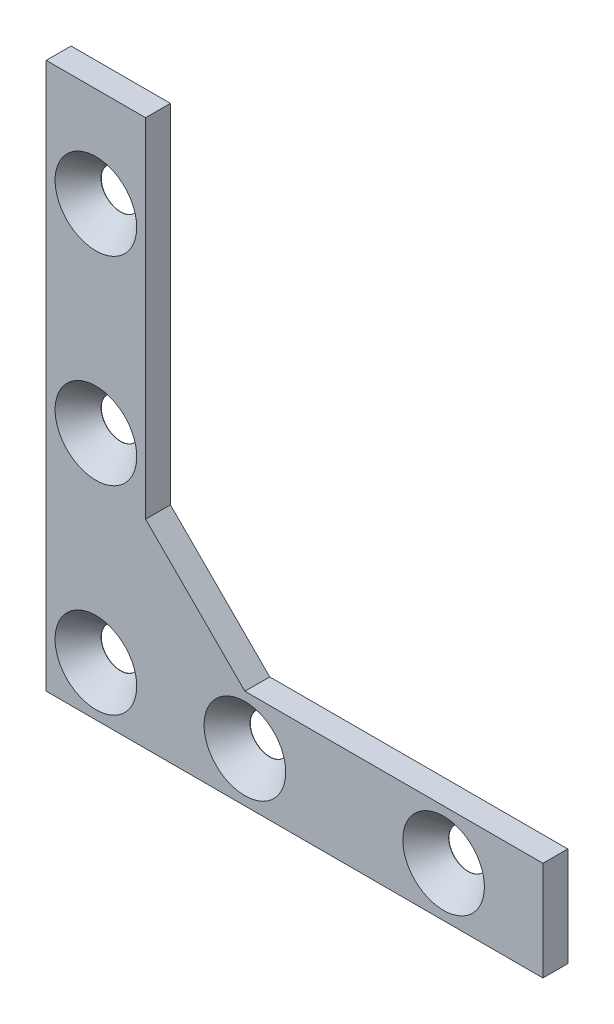
ISO-10303-21;
HEADER;
FILE_DESCRIPTION(('STEP AP214'),'2;1');
FILE_NAME('part.step','',(''),(''),'','','');
FILE_SCHEMA(('AUTOMOTIVE_DESIGN { 1 0 10303 214 1 1 1 1 }'));
ENDSEC;
DATA;
#1=APPLICATION_CONTEXT('core data for automotive mechanical design processes');
#2=APPLICATION_PROTOCOL_DEFINITION('international standard','automotive_design',2000,#1);
#3=PRODUCT_CONTEXT('',#1,'mechanical');
#4=PRODUCT('Part','Part','',(#3));
#5=PRODUCT_RELATED_PRODUCT_CATEGORY('part','',(#4));
#6=PRODUCT_DEFINITION_FORMATION('','',#4);
#7=PRODUCT_DEFINITION_CONTEXT('part definition',#1,'design');
#8=PRODUCT_DEFINITION('design','',#6,#7);
#9=PRODUCT_DEFINITION_SHAPE('','',#8);
#10=(LENGTH_UNIT() NAMED_UNIT(*) SI_UNIT(.MILLI.,.METRE.));
#11=(NAMED_UNIT(*) PLANE_ANGLE_UNIT() SI_UNIT($,.RADIAN.));
#12=(NAMED_UNIT(*) SI_UNIT($,.STERADIAN.) SOLID_ANGLE_UNIT());
#13=UNCERTAINTY_MEASURE_WITH_UNIT(LENGTH_MEASURE(1.E-05),#10,'distance_accuracy_value','');
#14=(GEOMETRIC_REPRESENTATION_CONTEXT(3) GLOBAL_UNCERTAINTY_ASSIGNED_CONTEXT((#13)) GLOBAL_UNIT_ASSIGNED_CONTEXT((#10,
#11,#12)) REPRESENTATION_CONTEXT('',''));
#15=CARTESIAN_POINT('',(0.,0.,0.));
#16=DIRECTION('',(0.,0.,1.));
#17=DIRECTION('',(1.,0.,0.));
#18=AXIS2_PLACEMENT_3D('',#15,#16,#17);
#19=CARTESIAN_POINT('',(-273.453367516007,-6.34999999999997,3.175));
#20=DIRECTION('',(0.,1.,0.));
#21=DIRECTION('',(0.,0.,1.));
#22=AXIS2_PLACEMENT_3D('',#19,#20,#21);
#23=PLANE('',#22);
#24=DIRECTION('',(1.,0.,0.));
#25=VECTOR('',#24,1.);
#26=CARTESIAN_POINT('',(-273.453367516007,-6.34999999999997,0.));
#27=LINE('',#26,#25);
#28=CARTESIAN_POINT('',(-273.453367516007,-6.34999999999997,0.));
#29=VERTEX_POINT('',#28);
#30=CARTESIAN_POINT('',(-209.953367516007,-6.34999999999997,0.));
#31=VERTEX_POINT('',#30);
#32=EDGE_CURVE('E129',#29,#31,#27,.T.);
#33=ORIENTED_EDGE('',*,*,#32,.T.);
#34=DIRECTION('',(0.,0.,-1.));
#35=VECTOR('',#34,1.);
#36=CARTESIAN_POINT('',(-209.953367516007,-6.34999999999997,3.175));
#37=LINE('',#36,#35);
#38=CARTESIAN_POINT('',(-209.953367516007,-6.34999999999997,3.175));
#39=VERTEX_POINT('',#38);
#40=EDGE_CURVE('E11',#39,#31,#37,.T.);
#41=ORIENTED_EDGE('',*,*,#40,.F.);
#42=DIRECTION('',(1.,0.,0.));
#43=VECTOR('',#42,1.);
#44=CARTESIAN_POINT('',(-273.453367516007,-6.34999999999997,3.175));
#45=LINE('',#44,#43);
#46=CARTESIAN_POINT('',(-273.453367516007,-6.34999999999997,3.175));
#47=VERTEX_POINT('',#46);
#48=EDGE_CURVE('E142',#47,#39,#45,.T.);
#49=ORIENTED_EDGE('',*,*,#48,.F.);
#50=DIRECTION('',(0.,0.,-1.));
#51=VECTOR('',#50,1.);
#52=CARTESIAN_POINT('',(-273.453367516007,-6.34999999999997,3.175));
#53=LINE('',#52,#51);
#54=EDGE_CURVE('E125',#47,#29,#53,.T.);
#55=ORIENTED_EDGE('',*,*,#54,.T.);
#56=EDGE_LOOP('',(#33,#41,#49,#55));
#57=FACE_BOUND('',#56,.T.);
#58=ADVANCED_FACE('F39',(#57),#23,.F.);
#59=CARTESIAN_POINT('',(-209.953367516007,-6.34999999999997,3.175));
#60=DIRECTION('',(-1.,0.,0.));
#61=DIRECTION('',(0.,0.,1.));
#62=AXIS2_PLACEMENT_3D('',#59,#60,#61);
#63=PLANE('',#62);
#64=DIRECTION('',(0.,1.,0.));
#65=VECTOR('',#64,1.);
#66=CARTESIAN_POINT('',(-209.953367516007,-6.34999999999997,0.));
#67=LINE('',#66,#65);
#68=CARTESIAN_POINT('',(-209.953367516007,6.3500000000002,0.));
#69=VERTEX_POINT('',#68);
#70=EDGE_CURVE('E132',#31,#69,#67,.T.);
#71=ORIENTED_EDGE('',*,*,#70,.T.);
#72=DIRECTION('',(0.,0.,-1.));
#73=VECTOR('',#72,1.);
#74=CARTESIAN_POINT('',(-209.953367516007,6.3500000000002,3.175));
#75=LINE('',#74,#73);
#76=CARTESIAN_POINT('',(-209.953367516007,6.3500000000002,3.175));
#77=VERTEX_POINT('',#76);
#78=EDGE_CURVE('E47',#77,#69,#75,.T.);
#79=ORIENTED_EDGE('',*,*,#78,.F.);
#80=DIRECTION('',(0.,1.,0.));
#81=VECTOR('',#80,1.);
#82=CARTESIAN_POINT('',(-209.953367516007,-6.34999999999997,3.175));
#83=LINE('',#82,#81);
#84=EDGE_CURVE('E95',#39,#77,#83,.T.);
#85=ORIENTED_EDGE('',*,*,#84,.F.);
#86=ORIENTED_EDGE('',*,*,#40,.T.);
#87=EDGE_LOOP('',(#71,#79,#85,#86));
#88=FACE_BOUND('',#87,.T.);
#89=ADVANCED_FACE('F241',(#88),#63,.F.);
#90=CARTESIAN_POINT('',(-209.953367516007,6.3500000000002,3.175));
#91=DIRECTION('',(0.,-1.,0.));
#92=DIRECTION('',(1.,0.,0.));
#93=AXIS2_PLACEMENT_3D('',#90,#91,#92);
#94=PLANE('',#93);
#95=DIRECTION('',(-1.,0.,0.));
#96=VECTOR('',#95,1.);
#97=CARTESIAN_POINT('',(-209.953367516007,6.3500000000002,0.));
#98=LINE('',#97,#96);
#99=CARTESIAN_POINT('',(-248.053367516008,6.35000000000003,0.));
#100=VERTEX_POINT('',#99);
#101=EDGE_CURVE('E135',#69,#100,#98,.T.);
#102=ORIENTED_EDGE('',*,*,#101,.T.);
#103=DIRECTION('',(0.,0.,-1.));
#104=VECTOR('',#103,1.);
#105=CARTESIAN_POINT('',(-248.053367516008,6.35000000000003,3.175));
#106=LINE('',#105,#104);
#107=CARTESIAN_POINT('',(-248.053367516008,6.35000000000003,3.175));
#108=VERTEX_POINT('',#107);
#109=EDGE_CURVE('E146',#108,#100,#106,.T.);
#110=ORIENTED_EDGE('',*,*,#109,.F.);
#111=DIRECTION('',(-1.,0.,0.));
#112=VECTOR('',#111,1.);
#113=CARTESIAN_POINT('',(-209.953367516007,6.3500000000002,3.175));
#114=LINE('',#113,#112);
#115=EDGE_CURVE('E154',#77,#108,#114,.T.);
#116=ORIENTED_EDGE('',*,*,#115,.F.);
#117=ORIENTED_EDGE('',*,*,#78,.T.);
#118=EDGE_LOOP('',(#102,#110,#116,#117));
#119=FACE_BOUND('',#118,.T.);
#120=ADVANCED_FACE('F152',(#119),#94,.F.);
#121=CARTESIAN_POINT('',(-248.053367516008,6.35000000000003,3.175));
#122=DIRECTION('',(-0.707106781186556,-0.707106781186539,0.));
#123=DIRECTION('',(0.707106781186539,-0.707106781186556,0.));
#124=AXIS2_PLACEMENT_3D('',#121,#122,#123);
#125=PLANE('',#124);
#126=DIRECTION('',(-0.707106781186539,0.707106781186556,0.));
#127=VECTOR('',#126,1.);
#128=CARTESIAN_POINT('',(-248.053367516008,6.35000000000003,0.));
#129=LINE('',#128,#127);
#130=CARTESIAN_POINT('',(-260.753367516007,19.05,0.));
#131=VERTEX_POINT('',#130);
#132=EDGE_CURVE('E137',#100,#131,#129,.T.);
#133=ORIENTED_EDGE('',*,*,#132,.T.);
#134=DIRECTION('',(0.,0.,-1.));
#135=VECTOR('',#134,1.);
#136=CARTESIAN_POINT('',(-260.753367516007,19.05,3.175));
#137=LINE('',#136,#135);
#138=CARTESIAN_POINT('',(-260.753367516007,19.05,3.175));
#139=VERTEX_POINT('',#138);
#140=EDGE_CURVE('E120',#139,#131,#137,.T.);
#141=ORIENTED_EDGE('',*,*,#140,.F.);
#142=DIRECTION('',(-0.707106781186539,0.707106781186556,0.));
#143=VECTOR('',#142,1.);
#144=CARTESIAN_POINT('',(-248.053367516008,6.35000000000003,3.175));
#145=LINE('',#144,#143);
#146=EDGE_CURVE('E111',#108,#139,#145,.T.);
#147=ORIENTED_EDGE('',*,*,#146,.F.);
#148=ORIENTED_EDGE('',*,*,#109,.T.);
#149=EDGE_LOOP('',(#133,#141,#147,#148));
#150=FACE_BOUND('',#149,.T.);
#151=ADVANCED_FACE('F160',(#150),#125,.F.);
#152=CARTESIAN_POINT('',(-260.753367516007,19.05,3.175));
#153=DIRECTION('',(-1.,0.,0.));
#154=DIRECTION('',(0.,0.,1.));
#155=AXIS2_PLACEMENT_3D('',#152,#153,#154);
#156=PLANE('',#155);
#157=DIRECTION('',(0.,1.,0.));
#158=VECTOR('',#157,1.);
#159=CARTESIAN_POINT('',(-260.753367516007,19.05,0.));
#160=LINE('',#159,#158);
#161=CARTESIAN_POINT('',(-260.753367516007,63.5,0.));
#162=VERTEX_POINT('',#161);
#163=EDGE_CURVE('E119',#131,#162,#160,.T.);
#164=ORIENTED_EDGE('',*,*,#163,.T.);
#165=DIRECTION('',(0.,0.,-1.));
#166=VECTOR('',#165,1.);
#167=CARTESIAN_POINT('',(-260.753367516007,63.5,3.175));
#168=LINE('',#167,#166);
#169=CARTESIAN_POINT('',(-260.753367516007,63.5,3.175));
#170=VERTEX_POINT('',#169);
#171=EDGE_CURVE('E116',#170,#162,#168,.T.);
#172=ORIENTED_EDGE('',*,*,#171,.F.);
#173=DIRECTION('',(0.,1.,0.));
#174=VECTOR('',#173,1.);
#175=CARTESIAN_POINT('',(-260.753367516007,19.05,3.175));
#176=LINE('',#175,#174);
#177=EDGE_CURVE('E105',#139,#170,#176,.T.);
#178=ORIENTED_EDGE('',*,*,#177,.F.);
#179=ORIENTED_EDGE('',*,*,#140,.T.);
#180=EDGE_LOOP('',(#164,#172,#178,#179));
#181=FACE_BOUND('',#180,.T.);
#182=ADVANCED_FACE('F117',(#181),#156,.F.);
#183=CARTESIAN_POINT('',(-273.453367516007,63.5,3.175));
#184=DIRECTION('',(0.,-1.,0.));
#185=DIRECTION('',(0.,0.,-1.));
#186=AXIS2_PLACEMENT_3D('',#183,#184,#185);
#187=PLANE('',#186);
#188=DIRECTION('',(-1.,0.,0.));
#189=VECTOR('',#188,1.);
#190=CARTESIAN_POINT('',(-273.453367516007,63.5,0.));
#191=LINE('',#190,#189);
#192=CARTESIAN_POINT('',(-273.453367516007,63.5,0.));
#193=VERTEX_POINT('',#192);
#194=EDGE_CURVE('E81',#162,#193,#191,.T.);
#195=ORIENTED_EDGE('',*,*,#194,.T.);
#196=DIRECTION('',(0.,0.,-1.));
#197=VECTOR('',#196,1.);
#198=CARTESIAN_POINT('',(-273.453367516007,63.5,3.175));
#199=LINE('',#198,#197);
#200=CARTESIAN_POINT('',(-273.453367516007,63.5,3.175));
#201=VERTEX_POINT('',#200);
#202=EDGE_CURVE('E121',#201,#193,#199,.T.);
#203=ORIENTED_EDGE('',*,*,#202,.F.);
#204=DIRECTION('',(-1.,0.,0.));
#205=VECTOR('',#204,1.);
#206=CARTESIAN_POINT('',(-273.453367516007,63.5,3.175));
#207=LINE('',#206,#205);
#208=EDGE_CURVE('E109',#170,#201,#207,.T.);
#209=ORIENTED_EDGE('',*,*,#208,.F.);
#210=ORIENTED_EDGE('',*,*,#171,.T.);
#211=EDGE_LOOP('',(#195,#203,#209,#210));
#212=FACE_BOUND('',#211,.T.);
#213=ADVANCED_FACE('F123',(#212),#187,.F.);
#214=CARTESIAN_POINT('',(-273.453367516007,-6.34999999999997,3.175));
#215=DIRECTION('',(1.,0.,0.));
#216=DIRECTION('',(0.,0.,-1.));
#217=AXIS2_PLACEMENT_3D('',#214,#215,#216);
#218=PLANE('',#217);
#219=DIRECTION('',(0.,-1.,0.));
#220=VECTOR('',#219,1.);
#221=CARTESIAN_POINT('',(-273.453367516007,-6.34999999999997,0.));
#222=LINE('',#221,#220);
#223=EDGE_CURVE('E87',#193,#29,#222,.T.);
#224=ORIENTED_EDGE('',*,*,#223,.T.);
#225=ORIENTED_EDGE('',*,*,#54,.F.);
#226=DIRECTION('',(0.,-1.,0.));
#227=VECTOR('',#226,1.);
#228=CARTESIAN_POINT('',(-273.453367516007,-6.34999999999997,3.175));
#229=LINE('',#228,#227);
#230=EDGE_CURVE('E55',#201,#47,#229,.T.);
#231=ORIENTED_EDGE('',*,*,#230,.F.);
#232=ORIENTED_EDGE('',*,*,#202,.T.);
#233=EDGE_LOOP('',(#224,#225,#231,#232));
#234=FACE_BOUND('',#233,.T.);
#235=ADVANCED_FACE('F214',(#234),#218,.F.);
#236=CARTESIAN_POINT('',(0.,0.,3.175));
#237=DIRECTION('',(0.,0.,1.));
#238=DIRECTION('',(1.,0.,0.));
#239=AXIS2_PLACEMENT_3D('',#236,#237,#238);
#240=PLANE('',#239);
#241=CARTESIAN_POINT('',(-267.103367516007,0.,3.175));
#242=DIRECTION('',(0.,0.,1.));
#243=DIRECTION('',(1.,0.,0.));
#244=AXIS2_PLACEMENT_3D('',#241,#242,#243);
#245=CIRCLE('',#244,5.21969999999999);
#246=CARTESIAN_POINT('',(-261.883667516008,0.,3.175));
#247=VERTEX_POINT('',#246);
#248=EDGE_CURVE('E206',#247,#247,#245,.T.);
#249=ORIENTED_EDGE('',*,*,#248,.F.);
#250=EDGE_LOOP('',(#249));
#251=FACE_BOUND('',#250,.T.);
#252=CARTESIAN_POINT('',(-267.103367516007,25.4,3.175));
#253=DIRECTION('',(0.,0.,1.));
#254=DIRECTION('',(1.,0.,0.));
#255=AXIS2_PLACEMENT_3D('',#252,#253,#254);
#256=CIRCLE('',#255,5.21969999999999);
#257=CARTESIAN_POINT('',(-261.883667516008,25.4,3.175));
#258=VERTEX_POINT('',#257);
#259=EDGE_CURVE('E197',#258,#258,#256,.T.);
#260=ORIENTED_EDGE('',*,*,#259,.F.);
#261=EDGE_LOOP('',(#260));
#262=FACE_BOUND('',#261,.T.);
#263=CARTESIAN_POINT('',(-267.103367516007,50.8,3.175));
#264=DIRECTION('',(0.,0.,1.));
#265=DIRECTION('',(1.,0.,0.));
#266=AXIS2_PLACEMENT_3D('',#263,#264,#265);
#267=CIRCLE('',#266,5.21969999999999);
#268=CARTESIAN_POINT('',(-261.883667516008,50.8,3.175));
#269=VERTEX_POINT('',#268);
#270=EDGE_CURVE('E188',#269,#269,#267,.T.);
#271=ORIENTED_EDGE('',*,*,#270,.F.);
#272=EDGE_LOOP('',(#271));
#273=FACE_BOUND('',#272,.T.);
#274=CARTESIAN_POINT('',(-248.053367516007,0.,3.175));
#275=DIRECTION('',(0.,0.,1.));
#276=DIRECTION('',(1.,0.,0.));
#277=AXIS2_PLACEMENT_3D('',#274,#275,#276);
#278=CIRCLE('',#277,5.21969999999999);
#279=CARTESIAN_POINT('',(-242.833667516007,0.,3.175));
#280=VERTEX_POINT('',#279);
#281=EDGE_CURVE('E179',#280,#280,#278,.T.);
#282=ORIENTED_EDGE('',*,*,#281,.F.);
#283=EDGE_LOOP('',(#282));
#284=FACE_BOUND('',#283,.T.);
#285=CARTESIAN_POINT('',(-222.653367516007,0.,3.175));
#286=DIRECTION('',(0.,0.,1.));
#287=DIRECTION('',(1.,0.,0.));
#288=AXIS2_PLACEMENT_3D('',#285,#286,#287);
#289=CIRCLE('',#288,5.21969999999999);
#290=CARTESIAN_POINT('',(-217.433667516007,0.,3.175));
#291=VERTEX_POINT('',#290);
#292=EDGE_CURVE('E170',#291,#291,#289,.T.);
#293=ORIENTED_EDGE('',*,*,#292,.F.);
#294=EDGE_LOOP('',(#293));
#295=FACE_BOUND('',#294,.T.);
#296=ORIENTED_EDGE('',*,*,#48,.T.);
#297=ORIENTED_EDGE('',*,*,#84,.T.);
#298=ORIENTED_EDGE('',*,*,#115,.T.);
#299=ORIENTED_EDGE('',*,*,#146,.T.);
#300=ORIENTED_EDGE('',*,*,#177,.T.);
#301=ORIENTED_EDGE('',*,*,#208,.T.);
#302=ORIENTED_EDGE('',*,*,#230,.T.);
#303=EDGE_LOOP('',(#296,#297,#298,#299,#300,#301,#302));
#304=FACE_BOUND('',#303,.T.);
#305=ADVANCED_FACE('F107',(#251,#262,#273,#284,#295,#304),#240,.T.);
#306=CARTESIAN_POINT('',(0.,0.,0.));
#307=DIRECTION('',(0.,0.,1.));
#308=DIRECTION('',(1.,0.,0.));
#309=AXIS2_PLACEMENT_3D('',#306,#307,#308);
#310=PLANE('',#309);
#311=CARTESIAN_POINT('',(-267.103367516007,0.,0.));
#312=DIRECTION('',(0.,0.,1.));
#313=DIRECTION('',(1.,0.,0.));
#314=AXIS2_PLACEMENT_3D('',#311,#312,#313);
#315=CIRCLE('',#314,2.48920000000002);
#316=CARTESIAN_POINT('',(-264.614167516007,0.,0.));
#317=VERTEX_POINT('',#316);
#318=EDGE_CURVE('E200',#317,#317,#315,.T.);
#319=ORIENTED_EDGE('',*,*,#318,.T.);
#320=EDGE_LOOP('',(#319));
#321=FACE_BOUND('',#320,.T.);
#322=CARTESIAN_POINT('',(-267.103367516007,25.4,0.));
#323=DIRECTION('',(0.,0.,1.));
#324=DIRECTION('',(1.,0.,0.));
#325=AXIS2_PLACEMENT_3D('',#322,#323,#324);
#326=CIRCLE('',#325,2.48920000000002);
#327=CARTESIAN_POINT('',(-264.614167516007,25.4,0.));
#328=VERTEX_POINT('',#327);
#329=EDGE_CURVE('E191',#328,#328,#326,.T.);
#330=ORIENTED_EDGE('',*,*,#329,.T.);
#331=EDGE_LOOP('',(#330));
#332=FACE_BOUND('',#331,.T.);
#333=CARTESIAN_POINT('',(-267.103367516007,50.8,0.));
#334=DIRECTION('',(0.,0.,1.));
#335=DIRECTION('',(1.,0.,0.));
#336=AXIS2_PLACEMENT_3D('',#333,#334,#335);
#337=CIRCLE('',#336,2.48920000000002);
#338=CARTESIAN_POINT('',(-264.614167516007,50.8,0.));
#339=VERTEX_POINT('',#338);
#340=EDGE_CURVE('E182',#339,#339,#337,.T.);
#341=ORIENTED_EDGE('',*,*,#340,.T.);
#342=EDGE_LOOP('',(#341));
#343=FACE_BOUND('',#342,.T.);
#344=CARTESIAN_POINT('',(-248.053367516007,0.,0.));
#345=DIRECTION('',(0.,0.,1.));
#346=DIRECTION('',(1.,0.,0.));
#347=AXIS2_PLACEMENT_3D('',#344,#345,#346);
#348=CIRCLE('',#347,2.4892);
#349=CARTESIAN_POINT('',(-245.564167516007,0.,0.));
#350=VERTEX_POINT('',#349);
#351=EDGE_CURVE('E173',#350,#350,#348,.T.);
#352=ORIENTED_EDGE('',*,*,#351,.T.);
#353=EDGE_LOOP('',(#352));
#354=FACE_BOUND('',#353,.T.);
#355=CARTESIAN_POINT('',(-222.653367516007,0.,0.));
#356=DIRECTION('',(0.,0.,1.));
#357=DIRECTION('',(1.,0.,0.));
#358=AXIS2_PLACEMENT_3D('',#355,#356,#357);
#359=CIRCLE('',#358,2.4892);
#360=CARTESIAN_POINT('',(-220.164167516007,0.,0.));
#361=VERTEX_POINT('',#360);
#362=EDGE_CURVE('E133',#361,#361,#359,.T.);
#363=ORIENTED_EDGE('',*,*,#362,.T.);
#364=EDGE_LOOP('',(#363));
#365=FACE_BOUND('',#364,.T.);
#366=ORIENTED_EDGE('',*,*,#32,.F.);
#367=ORIENTED_EDGE('',*,*,#223,.F.);
#368=ORIENTED_EDGE('',*,*,#194,.F.);
#369=ORIENTED_EDGE('',*,*,#163,.F.);
#370=ORIENTED_EDGE('',*,*,#132,.F.);
#371=ORIENTED_EDGE('',*,*,#101,.F.);
#372=ORIENTED_EDGE('',*,*,#70,.F.);
#373=EDGE_LOOP('',(#366,#367,#368,#369,#370,#371,#372));
#374=FACE_BOUND('',#373,.T.);
#375=ADVANCED_FACE('F158',(#321,#332,#343,#354,#365,#374),#310,.F.);
#376=CARTESIAN_POINT('',(-222.653367516007,0.,3.175));
#377=DIRECTION('',(0.,0.,1.));
#378=DIRECTION('',(1.,0.,0.));
#379=AXIS2_PLACEMENT_3D('',#376,#377,#378);
#380=CYLINDRICAL_SURFACE('',#379,2.4892);
#381=ORIENTED_EDGE('',*,*,#362,.F.);
#382=EDGE_LOOP('',(#381));
#383=FACE_BOUND('',#382,.T.);
#384=CARTESIAN_POINT('',(-222.653367516007,0.,0.0339190640830126));
#385=DIRECTION('',(0.,0.,1.));
#386=DIRECTION('',(1.,0.,0.));
#387=AXIS2_PLACEMENT_3D('',#384,#385,#386);
#388=CIRCLE('',#387,2.4892);
#389=CARTESIAN_POINT('',(-220.164167516007,0.,0.0339190640830126));
#390=VERTEX_POINT('',#389);
#391=EDGE_CURVE('E167',#390,#390,#388,.T.);
#392=ORIENTED_EDGE('',*,*,#391,.T.);
#393=EDGE_LOOP('',(#392));
#394=FACE_BOUND('',#393,.T.);
#395=ADVANCED_FACE('F227',(#383,#394),#380,.F.);
#396=CARTESIAN_POINT('',(-222.653367516007,0.,3.175));
#397=DIRECTION('',(0.,0.,1.));
#398=DIRECTION('',(1.,0.,0.));
#399=AXIS2_PLACEMENT_3D('',#396,#397,#398);
#400=CONICAL_SURFACE('',#399,5.21969999999999,0.715584993317671);
#401=ORIENTED_EDGE('',*,*,#391,.F.);
#402=EDGE_LOOP('',(#401));
#403=FACE_BOUND('',#402,.T.);
#404=ORIENTED_EDGE('',*,*,#292,.T.);
#405=EDGE_LOOP('',(#404));
#406=FACE_BOUND('',#405,.T.);
#407=ADVANCED_FACE('F224',(#403,#406),#400,.F.);
#408=CARTESIAN_POINT('',(-248.053367516007,0.,3.175));
#409=DIRECTION('',(0.,0.,1.));
#410=DIRECTION('',(1.,0.,0.));
#411=AXIS2_PLACEMENT_3D('',#408,#409,#410);
#412=CYLINDRICAL_SURFACE('',#411,2.4892);
#413=ORIENTED_EDGE('',*,*,#351,.F.);
#414=EDGE_LOOP('',(#413));
#415=FACE_BOUND('',#414,.T.);
#416=CARTESIAN_POINT('',(-248.053367516007,0.,0.0339190640830126));
#417=DIRECTION('',(0.,0.,1.));
#418=DIRECTION('',(1.,0.,0.));
#419=AXIS2_PLACEMENT_3D('',#416,#417,#418);
#420=CIRCLE('',#419,2.4892);
#421=CARTESIAN_POINT('',(-245.564167516007,0.,0.0339190640830126));
#422=VERTEX_POINT('',#421);
#423=EDGE_CURVE('E176',#422,#422,#420,.T.);
#424=ORIENTED_EDGE('',*,*,#423,.T.);
#425=EDGE_LOOP('',(#424));
#426=FACE_BOUND('',#425,.T.);
#427=ADVANCED_FACE('F226',(#415,#426),#412,.F.);
#428=CARTESIAN_POINT('',(-248.053367516007,0.,3.175));
#429=DIRECTION('',(0.,0.,1.));
#430=DIRECTION('',(1.,0.,0.));
#431=AXIS2_PLACEMENT_3D('',#428,#429,#430);
#432=CONICAL_SURFACE('',#431,5.21969999999999,0.715584993317671);
#433=ORIENTED_EDGE('',*,*,#423,.F.);
#434=EDGE_LOOP('',(#433));
#435=FACE_BOUND('',#434,.T.);
#436=ORIENTED_EDGE('',*,*,#281,.T.);
#437=EDGE_LOOP('',(#436));
#438=FACE_BOUND('',#437,.T.);
#439=ADVANCED_FACE('F234',(#435,#438),#432,.F.);
#440=CARTESIAN_POINT('',(-267.103367516007,50.8,3.175));
#441=DIRECTION('',(0.,0.,1.));
#442=DIRECTION('',(1.,0.,0.));
#443=AXIS2_PLACEMENT_3D('',#440,#441,#442);
#444=CYLINDRICAL_SURFACE('',#443,2.4892);
#445=ORIENTED_EDGE('',*,*,#340,.F.);
#446=EDGE_LOOP('',(#445));
#447=FACE_BOUND('',#446,.T.);
#448=CARTESIAN_POINT('',(-267.103367516007,50.8,0.0339190640830126));
#449=DIRECTION('',(0.,0.,1.));
#450=DIRECTION('',(1.,0.,0.));
#451=AXIS2_PLACEMENT_3D('',#448,#449,#450);
#452=CIRCLE('',#451,2.48919999999997);
#453=CARTESIAN_POINT('',(-264.614167516008,50.8,0.0339190640830126));
#454=VERTEX_POINT('',#453);
#455=EDGE_CURVE('E185',#454,#454,#452,.T.);
#456=ORIENTED_EDGE('',*,*,#455,.T.);
#457=EDGE_LOOP('',(#456));
#458=FACE_BOUND('',#457,.T.);
#459=ADVANCED_FACE('F327',(#447,#458),#444,.F.);
#460=CARTESIAN_POINT('',(-267.103367516007,50.8,3.175));
#461=DIRECTION('',(0.,0.,1.));
#462=DIRECTION('',(1.,0.,0.));
#463=AXIS2_PLACEMENT_3D('',#460,#461,#462);
#464=CONICAL_SURFACE('',#463,5.21969999999999,0.715584993317676);
#465=ORIENTED_EDGE('',*,*,#455,.F.);
#466=EDGE_LOOP('',(#465));
#467=FACE_BOUND('',#466,.T.);
#468=ORIENTED_EDGE('',*,*,#270,.T.);
#469=EDGE_LOOP('',(#468));
#470=FACE_BOUND('',#469,.T.);
#471=ADVANCED_FACE('F338',(#467,#470),#464,.F.);
#472=CARTESIAN_POINT('',(-267.103367516007,25.4,3.175));
#473=DIRECTION('',(0.,0.,1.));
#474=DIRECTION('',(1.,0.,0.));
#475=AXIS2_PLACEMENT_3D('',#472,#473,#474);
#476=CYLINDRICAL_SURFACE('',#475,2.4892);
#477=ORIENTED_EDGE('',*,*,#329,.F.);
#478=EDGE_LOOP('',(#477));
#479=FACE_BOUND('',#478,.T.);
#480=CARTESIAN_POINT('',(-267.103367516007,25.4,0.0339190640830126));
#481=DIRECTION('',(0.,0.,1.));
#482=DIRECTION('',(1.,0.,0.));
#483=AXIS2_PLACEMENT_3D('',#480,#481,#482);
#484=CIRCLE('',#483,2.48919999999997);
#485=CARTESIAN_POINT('',(-264.614167516008,25.4,0.0339190640830126));
#486=VERTEX_POINT('',#485);
#487=EDGE_CURVE('E194',#486,#486,#484,.T.);
#488=ORIENTED_EDGE('',*,*,#487,.T.);
#489=EDGE_LOOP('',(#488));
#490=FACE_BOUND('',#489,.T.);
#491=ADVANCED_FACE('F349',(#479,#490),#476,.F.);
#492=CARTESIAN_POINT('',(-267.103367516007,25.4,3.175));
#493=DIRECTION('',(0.,0.,1.));
#494=DIRECTION('',(1.,0.,0.));
#495=AXIS2_PLACEMENT_3D('',#492,#493,#494);
#496=CONICAL_SURFACE('',#495,5.21969999999999,0.715584993317676);
#497=ORIENTED_EDGE('',*,*,#487,.F.);
#498=EDGE_LOOP('',(#497));
#499=FACE_BOUND('',#498,.T.);
#500=ORIENTED_EDGE('',*,*,#259,.T.);
#501=EDGE_LOOP('',(#500));
#502=FACE_BOUND('',#501,.T.);
#503=ADVANCED_FACE('F360',(#499,#502),#496,.F.);
#504=CARTESIAN_POINT('',(-267.103367516007,0.,3.175));
#505=DIRECTION('',(0.,0.,1.));
#506=DIRECTION('',(1.,0.,0.));
#507=AXIS2_PLACEMENT_3D('',#504,#505,#506);
#508=CYLINDRICAL_SURFACE('',#507,2.4892);
#509=ORIENTED_EDGE('',*,*,#318,.F.);
#510=EDGE_LOOP('',(#509));
#511=FACE_BOUND('',#510,.T.);
#512=CARTESIAN_POINT('',(-267.103367516007,0.,0.0339190640830126));
#513=DIRECTION('',(0.,0.,1.));
#514=DIRECTION('',(1.,0.,0.));
#515=AXIS2_PLACEMENT_3D('',#512,#513,#514);
#516=CIRCLE('',#515,2.48919999999997);
#517=CARTESIAN_POINT('',(-264.614167516008,0.,0.0339190640830126));
#518=VERTEX_POINT('',#517);
#519=EDGE_CURVE('E203',#518,#518,#516,.T.);
#520=ORIENTED_EDGE('',*,*,#519,.T.);
#521=EDGE_LOOP('',(#520));
#522=FACE_BOUND('',#521,.T.);
#523=ADVANCED_FACE('F371',(#511,#522),#508,.F.);
#524=CARTESIAN_POINT('',(-267.103367516007,0.,3.175));
#525=DIRECTION('',(0.,0.,1.));
#526=DIRECTION('',(1.,0.,0.));
#527=AXIS2_PLACEMENT_3D('',#524,#525,#526);
#528=CONICAL_SURFACE('',#527,5.21969999999999,0.715584993317676);
#529=ORIENTED_EDGE('',*,*,#519,.F.);
#530=EDGE_LOOP('',(#529));
#531=FACE_BOUND('',#530,.T.);
#532=ORIENTED_EDGE('',*,*,#248,.T.);
#533=EDGE_LOOP('',(#532));
#534=FACE_BOUND('',#533,.T.);
#535=ADVANCED_FACE('F210',(#531,#534),#528,.F.);
#536=CLOSED_SHELL('',(#58,#89,#120,#151,#182,#213,#235,#305,#375,#395,#407,#427,#439,#459,#471,
#491,#503,#523,#535));
#537=MANIFOLD_SOLID_BREP('B2',#536);
#538=ADVANCED_BREP_SHAPE_REPRESENTATION('',(#18,#537),#14);
#539=SHAPE_DEFINITION_REPRESENTATION(#9,#538);
ENDSEC;
END-ISO-10303-21;
